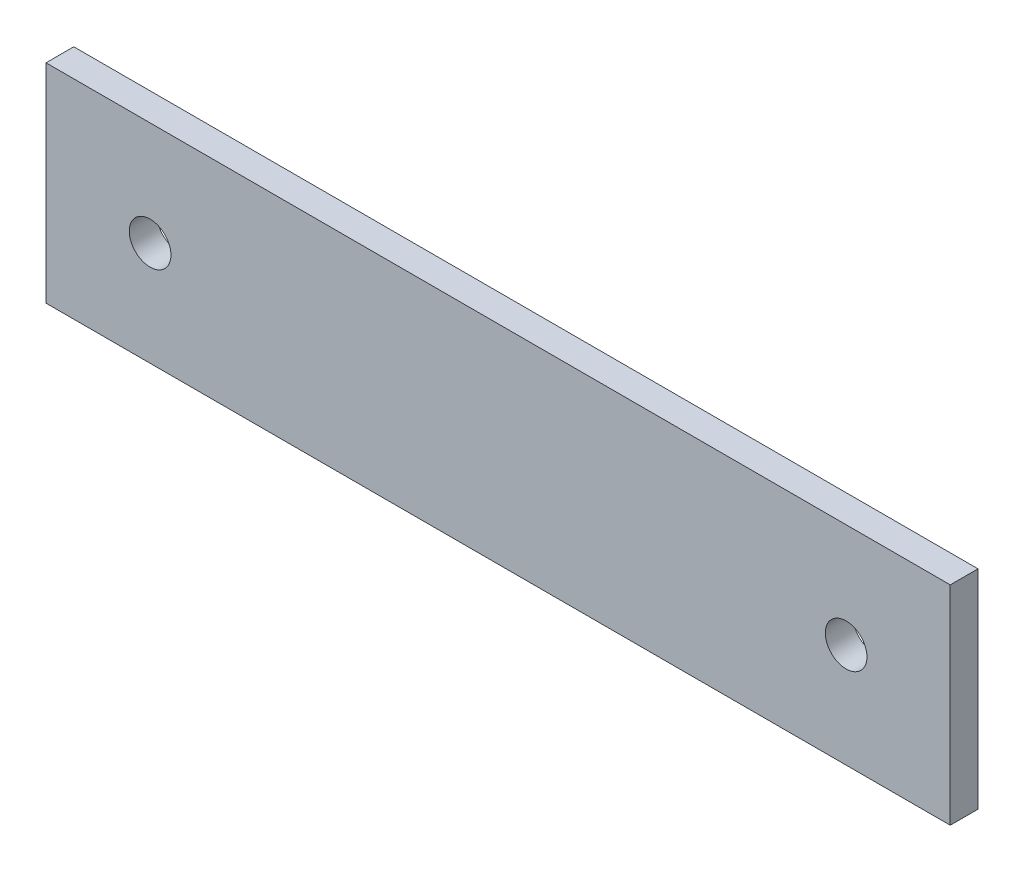
ISO-10303-21;
HEADER;
FILE_DESCRIPTION(('STEP AP214'),'2;1');
FILE_NAME('part.step','',(''),(''),'','','');
FILE_SCHEMA(('AUTOMOTIVE_DESIGN { 1 0 10303 214 1 1 1 1 }'));
ENDSEC;
DATA;
#1=APPLICATION_CONTEXT('core data for automotive mechanical design processes');
#2=APPLICATION_PROTOCOL_DEFINITION('international standard','automotive_design',2000,#1);
#3=PRODUCT_CONTEXT('',#1,'mechanical');
#4=PRODUCT('Part','Part','',(#3));
#5=PRODUCT_RELATED_PRODUCT_CATEGORY('part','',(#4));
#6=PRODUCT_DEFINITION_FORMATION('','',#4);
#7=PRODUCT_DEFINITION_CONTEXT('part definition',#1,'design');
#8=PRODUCT_DEFINITION('design','',#6,#7);
#9=PRODUCT_DEFINITION_SHAPE('','',#8);
#10=(LENGTH_UNIT() NAMED_UNIT(*) SI_UNIT(.MILLI.,.METRE.));
#11=(NAMED_UNIT(*) PLANE_ANGLE_UNIT() SI_UNIT($,.RADIAN.));
#12=(NAMED_UNIT(*) SI_UNIT($,.STERADIAN.) SOLID_ANGLE_UNIT());
#13=UNCERTAINTY_MEASURE_WITH_UNIT(LENGTH_MEASURE(1.E-05),#10,'distance_accuracy_value','');
#14=(GEOMETRIC_REPRESENTATION_CONTEXT(3) GLOBAL_UNCERTAINTY_ASSIGNED_CONTEXT((#13)) GLOBAL_UNIT_ASSIGNED_CONTEXT((#10,
#11,#12)) REPRESENTATION_CONTEXT('',''));
#15=CARTESIAN_POINT('',(0.,0.,0.));
#16=DIRECTION('',(0.,0.,1.));
#17=DIRECTION('',(1.,0.,0.));
#18=AXIS2_PLACEMENT_3D('',#15,#16,#17);
#19=CARTESIAN_POINT('',(0.,0.,2.));
#20=DIRECTION('',(0.,0.,-1.));
#21=DIRECTION('',(-1.,0.,0.));
#22=AXIS2_PLACEMENT_3D('',#19,#20,#21);
#23=PLANE('',#22);
#24=DIRECTION('',(0.,1.,0.));
#25=VECTOR('',#24,1.);
#26=CARTESIAN_POINT('',(115.3,-15.,2.));
#27=LINE('',#26,#25);
#28=CARTESIAN_POINT('',(115.3,-15.,2.));
#29=VERTEX_POINT('',#28);
#30=CARTESIAN_POINT('',(115.3,15.,2.));
#31=VERTEX_POINT('',#30);
#32=EDGE_CURVE('E99',#29,#31,#27,.T.);
#33=ORIENTED_EDGE('',*,*,#32,.T.);
#34=DIRECTION('',(-1.,0.,0.));
#35=VECTOR('',#34,1.);
#36=CARTESIAN_POINT('',(-15.,15.,2.));
#37=LINE('',#36,#35);
#38=CARTESIAN_POINT('',(-15.,15.,2.));
#39=VERTEX_POINT('',#38);
#40=EDGE_CURVE('E92',#31,#39,#37,.T.);
#41=ORIENTED_EDGE('',*,*,#40,.T.);
#42=DIRECTION('',(0.,-1.,0.));
#43=VECTOR('',#42,1.);
#44=CARTESIAN_POINT('',(-15.,-15.,2.));
#45=LINE('',#44,#43);
#46=CARTESIAN_POINT('',(-15.,-15.,2.));
#47=VERTEX_POINT('',#46);
#48=EDGE_CURVE('E98',#39,#47,#45,.T.);
#49=ORIENTED_EDGE('',*,*,#48,.T.);
#50=DIRECTION('',(1.,0.,0.));
#51=VECTOR('',#50,1.);
#52=CARTESIAN_POINT('',(-15.,-15.,2.));
#53=LINE('',#52,#51);
#54=EDGE_CURVE('E63',#47,#29,#53,.T.);
#55=ORIENTED_EDGE('',*,*,#54,.T.);
#56=EDGE_LOOP('',(#33,#41,#49,#55));
#57=FACE_BOUND('',#56,.T.);
#58=CARTESIAN_POINT('',(0.,0.,2.));
#59=DIRECTION('',(0.,0.,1.));
#60=DIRECTION('',(1.,0.,0.));
#61=AXIS2_PLACEMENT_3D('',#58,#59,#60);
#62=CIRCLE('',#61,3.);
#63=CARTESIAN_POINT('',(3.,0.,2.));
#64=VERTEX_POINT('',#63);
#65=EDGE_CURVE('E113',#64,#64,#62,.T.);
#66=ORIENTED_EDGE('',*,*,#65,.F.);
#67=EDGE_LOOP('',(#66));
#68=FACE_BOUND('',#67,.T.);
#69=CARTESIAN_POINT('',(100.3,0.,2.));
#70=DIRECTION('',(0.,0.,1.));
#71=DIRECTION('',(1.,0.,0.));
#72=AXIS2_PLACEMENT_3D('',#69,#70,#71);
#73=CIRCLE('',#72,3.);
#74=CARTESIAN_POINT('',(103.3,0.,2.));
#75=VERTEX_POINT('',#74);
#76=EDGE_CURVE('E128',#75,#75,#73,.T.);
#77=ORIENTED_EDGE('',*,*,#76,.F.);
#78=EDGE_LOOP('',(#77));
#79=FACE_BOUND('',#78,.T.);
#80=ADVANCED_FACE('F50',(#57,#68,#79),#23,.F.);
#81=CARTESIAN_POINT('',(0.,0.,-2.));
#82=DIRECTION('',(0.,0.,-1.));
#83=DIRECTION('',(-1.,0.,0.));
#84=AXIS2_PLACEMENT_3D('',#81,#82,#83);
#85=PLANE('',#84);
#86=CARTESIAN_POINT('',(0.,0.,-2.));
#87=DIRECTION('',(0.,0.,1.));
#88=DIRECTION('',(1.,0.,0.));
#89=AXIS2_PLACEMENT_3D('',#86,#87,#88);
#90=CIRCLE('',#89,3.);
#91=CARTESIAN_POINT('',(3.,0.,-2.));
#92=VERTEX_POINT('',#91);
#93=EDGE_CURVE('E130',#92,#92,#90,.T.);
#94=ORIENTED_EDGE('',*,*,#93,.T.);
#95=EDGE_LOOP('',(#94));
#96=FACE_BOUND('',#95,.T.);
#97=DIRECTION('',(0.,1.,0.));
#98=VECTOR('',#97,1.);
#99=CARTESIAN_POINT('',(115.3,-15.,-2.));
#100=LINE('',#99,#98);
#101=CARTESIAN_POINT('',(115.3,-15.,-2.));
#102=VERTEX_POINT('',#101);
#103=CARTESIAN_POINT('',(115.3,15.,-2.));
#104=VERTEX_POINT('',#103);
#105=EDGE_CURVE('E115',#102,#104,#100,.T.);
#106=ORIENTED_EDGE('',*,*,#105,.F.);
#107=DIRECTION('',(1.,0.,0.));
#108=VECTOR('',#107,1.);
#109=CARTESIAN_POINT('',(-15.,-15.,-2.));
#110=LINE('',#109,#108);
#111=CARTESIAN_POINT('',(-15.,-15.,-2.));
#112=VERTEX_POINT('',#111);
#113=EDGE_CURVE('E86',#112,#102,#110,.T.);
#114=ORIENTED_EDGE('',*,*,#113,.F.);
#115=DIRECTION('',(0.,-1.,0.));
#116=VECTOR('',#115,1.);
#117=CARTESIAN_POINT('',(-15.,-15.,-2.));
#118=LINE('',#117,#116);
#119=CARTESIAN_POINT('',(-15.,15.,-2.));
#120=VERTEX_POINT('',#119);
#121=EDGE_CURVE('E82',#120,#112,#118,.T.);
#122=ORIENTED_EDGE('',*,*,#121,.F.);
#123=DIRECTION('',(-1.,0.,0.));
#124=VECTOR('',#123,1.);
#125=CARTESIAN_POINT('',(-15.,15.,-2.));
#126=LINE('',#125,#124);
#127=EDGE_CURVE('E102',#104,#120,#126,.T.);
#128=ORIENTED_EDGE('',*,*,#127,.F.);
#129=EDGE_LOOP('',(#106,#114,#122,#128));
#130=FACE_BOUND('',#129,.T.);
#131=CARTESIAN_POINT('',(100.3,0.,-2.));
#132=DIRECTION('',(0.,0.,1.));
#133=DIRECTION('',(1.,0.,0.));
#134=AXIS2_PLACEMENT_3D('',#131,#132,#133);
#135=CIRCLE('',#134,3.);
#136=CARTESIAN_POINT('',(103.3,0.,-2.));
#137=VERTEX_POINT('',#136);
#138=EDGE_CURVE('E135',#137,#137,#135,.T.);
#139=ORIENTED_EDGE('',*,*,#138,.T.);
#140=EDGE_LOOP('',(#139));
#141=FACE_BOUND('',#140,.T.);
#142=ADVANCED_FACE('F124',(#96,#130,#141),#85,.T.);
#143=CARTESIAN_POINT('',(115.3,-15.,2.));
#144=DIRECTION('',(-1.,0.,0.));
#145=DIRECTION('',(0.,0.,1.));
#146=AXIS2_PLACEMENT_3D('',#143,#144,#145);
#147=PLANE('',#146);
#148=ORIENTED_EDGE('',*,*,#105,.T.);
#149=DIRECTION('',(0.,0.,-1.));
#150=VECTOR('',#149,1.);
#151=CARTESIAN_POINT('',(115.3,15.,2.));
#152=LINE('',#151,#150);
#153=EDGE_CURVE('E11',#31,#104,#152,.T.);
#154=ORIENTED_EDGE('',*,*,#153,.F.);
#155=ORIENTED_EDGE('',*,*,#32,.F.);
#156=DIRECTION('',(0.,0.,-1.));
#157=VECTOR('',#156,1.);
#158=CARTESIAN_POINT('',(115.3,-15.,2.));
#159=LINE('',#158,#157);
#160=EDGE_CURVE('E107',#29,#102,#159,.T.);
#161=ORIENTED_EDGE('',*,*,#160,.T.);
#162=EDGE_LOOP('',(#148,#154,#155,#161));
#163=FACE_BOUND('',#162,.T.);
#164=ADVANCED_FACE('F49',(#163),#147,.F.);
#165=CARTESIAN_POINT('',(-15.,15.,2.));
#166=DIRECTION('',(0.,-1.,0.));
#167=DIRECTION('',(0.,0.,-1.));
#168=AXIS2_PLACEMENT_3D('',#165,#166,#167);
#169=PLANE('',#168);
#170=ORIENTED_EDGE('',*,*,#127,.T.);
#171=DIRECTION('',(0.,0.,-1.));
#172=VECTOR('',#171,1.);
#173=CARTESIAN_POINT('',(-15.,15.,2.));
#174=LINE('',#173,#172);
#175=EDGE_CURVE('E60',#39,#120,#174,.T.);
#176=ORIENTED_EDGE('',*,*,#175,.F.);
#177=ORIENTED_EDGE('',*,*,#40,.F.);
#178=ORIENTED_EDGE('',*,*,#153,.T.);
#179=EDGE_LOOP('',(#170,#176,#177,#178));
#180=FACE_BOUND('',#179,.T.);
#181=ADVANCED_FACE('F103',(#180),#169,.F.);
#182=CARTESIAN_POINT('',(-15.,-15.,2.));
#183=DIRECTION('',(1.,0.,0.));
#184=DIRECTION('',(0.,0.,-1.));
#185=AXIS2_PLACEMENT_3D('',#182,#183,#184);
#186=PLANE('',#185);
#187=ORIENTED_EDGE('',*,*,#121,.T.);
#188=DIRECTION('',(0.,0.,-1.));
#189=VECTOR('',#188,1.);
#190=CARTESIAN_POINT('',(-15.,-15.,2.));
#191=LINE('',#190,#189);
#192=EDGE_CURVE('E104',#47,#112,#191,.T.);
#193=ORIENTED_EDGE('',*,*,#192,.F.);
#194=ORIENTED_EDGE('',*,*,#48,.F.);
#195=ORIENTED_EDGE('',*,*,#175,.T.);
#196=EDGE_LOOP('',(#187,#193,#194,#195));
#197=FACE_BOUND('',#196,.T.);
#198=ADVANCED_FACE('F106',(#197),#186,.F.);
#199=CARTESIAN_POINT('',(-15.,-15.,2.));
#200=DIRECTION('',(0.,1.,0.));
#201=DIRECTION('',(0.,0.,1.));
#202=AXIS2_PLACEMENT_3D('',#199,#200,#201);
#203=PLANE('',#202);
#204=ORIENTED_EDGE('',*,*,#113,.T.);
#205=ORIENTED_EDGE('',*,*,#160,.F.);
#206=ORIENTED_EDGE('',*,*,#54,.F.);
#207=ORIENTED_EDGE('',*,*,#192,.T.);
#208=EDGE_LOOP('',(#204,#205,#206,#207));
#209=FACE_BOUND('',#208,.T.);
#210=ADVANCED_FACE('F118',(#209),#203,.F.);
#211=CARTESIAN_POINT('',(0.,0.,2.));
#212=DIRECTION('',(0.,0.,-1.));
#213=DIRECTION('',(-1.,0.,0.));
#214=AXIS2_PLACEMENT_3D('',#211,#212,#213);
#215=CYLINDRICAL_SURFACE('',#214,3.);
#216=ORIENTED_EDGE('',*,*,#65,.T.);
#217=EDGE_LOOP('',(#216));
#218=FACE_BOUND('',#217,.T.);
#219=ORIENTED_EDGE('',*,*,#93,.F.);
#220=EDGE_LOOP('',(#219));
#221=FACE_BOUND('',#220,.T.);
#222=ADVANCED_FACE('F153',(#218,#221),#215,.F.);
#223=CARTESIAN_POINT('',(100.3,0.,2.));
#224=DIRECTION('',(0.,0.,-1.));
#225=DIRECTION('',(-1.,0.,0.));
#226=AXIS2_PLACEMENT_3D('',#223,#224,#225);
#227=CYLINDRICAL_SURFACE('',#226,3.);
#228=ORIENTED_EDGE('',*,*,#76,.T.);
#229=EDGE_LOOP('',(#228));
#230=FACE_BOUND('',#229,.T.);
#231=ORIENTED_EDGE('',*,*,#138,.F.);
#232=EDGE_LOOP('',(#231));
#233=FACE_BOUND('',#232,.T.);
#234=ADVANCED_FACE('F138',(#230,#233),#227,.F.);
#235=CLOSED_SHELL('',(#80,#142,#164,#181,#198,#210,#222,#234));
#236=MANIFOLD_SOLID_BREP('B2',#235);
#237=ADVANCED_BREP_SHAPE_REPRESENTATION('',(#18,#236),#14);
#238=SHAPE_DEFINITION_REPRESENTATION(#9,#237);
ENDSEC;
END-ISO-10303-21;
